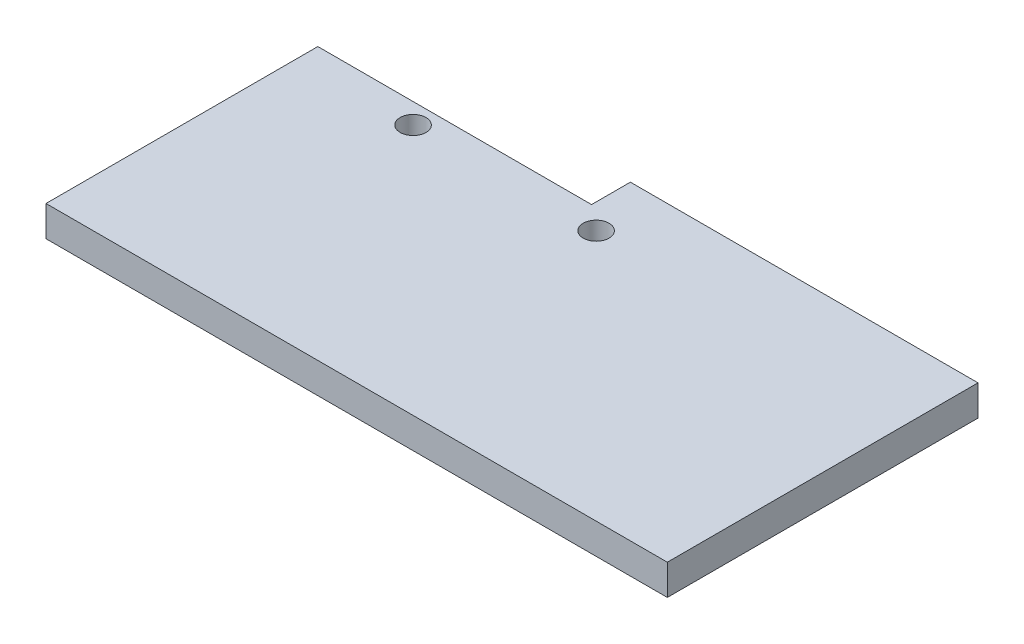
ISO-10303-21;
HEADER;
FILE_DESCRIPTION(('STEP AP214'),'2;1');
FILE_NAME('part.step','',(''),(''),'','','');
FILE_SCHEMA(('AUTOMOTIVE_DESIGN { 1 0 10303 214 1 1 1 1 }'));
ENDSEC;
DATA;
#1=APPLICATION_CONTEXT('core data for automotive mechanical design processes');
#2=APPLICATION_PROTOCOL_DEFINITION('international standard','automotive_design',2000,#1);
#3=PRODUCT_CONTEXT('',#1,'mechanical');
#4=PRODUCT('Part','Part','',(#3));
#5=PRODUCT_RELATED_PRODUCT_CATEGORY('part','',(#4));
#6=PRODUCT_DEFINITION_FORMATION('','',#4);
#7=PRODUCT_DEFINITION_CONTEXT('part definition',#1,'design');
#8=PRODUCT_DEFINITION('design','',#6,#7);
#9=PRODUCT_DEFINITION_SHAPE('','',#8);
#10=(LENGTH_UNIT() NAMED_UNIT(*) SI_UNIT(.MILLI.,.METRE.));
#11=(NAMED_UNIT(*) PLANE_ANGLE_UNIT() SI_UNIT($,.RADIAN.));
#12=(NAMED_UNIT(*) SI_UNIT($,.STERADIAN.) SOLID_ANGLE_UNIT());
#13=UNCERTAINTY_MEASURE_WITH_UNIT(LENGTH_MEASURE(1.E-05),#10,'distance_accuracy_value','');
#14=(GEOMETRIC_REPRESENTATION_CONTEXT(3) GLOBAL_UNCERTAINTY_ASSIGNED_CONTEXT((#13)) GLOBAL_UNIT_ASSIGNED_CONTEXT((#10,
#11,#12)) REPRESENTATION_CONTEXT('',''));
#15=CARTESIAN_POINT('',(0.,0.,0.));
#16=DIRECTION('',(0.,0.,1.));
#17=DIRECTION('',(1.,0.,0.));
#18=AXIS2_PLACEMENT_3D('',#15,#16,#17);
#19=CARTESIAN_POINT('',(-50.9391301805522,59.944,-35.3639480629795));
#20=DIRECTION('',(1.,0.,0.));
#21=DIRECTION('',(0.,0.,-1.));
#22=AXIS2_PLACEMENT_3D('',#19,#20,#21);
#23=PLANE('',#22);
#24=DIRECTION('',(0.,0.,1.));
#25=VECTOR('',#24,1.);
#26=CARTESIAN_POINT('',(-50.9391301805522,59.944,-35.3639480629795));
#27=LINE('',#26,#25);
#28=CARTESIAN_POINT('',(-50.9391301805522,59.944,40.8360519370205));
#29=VERTEX_POINT('',#28);
#30=CARTESIAN_POINT('',(-50.9391301805521,59.944,574.236051937021));
#31=VERTEX_POINT('',#30);
#32=EDGE_CURVE('E76',#29,#31,#27,.T.);
#33=ORIENTED_EDGE('',*,*,#32,.F.);
#34=DIRECTION('',(0.,-1.,0.));
#35=VECTOR('',#34,1.);
#36=CARTESIAN_POINT('',(-50.9391301805522,59.944,40.8360519370205));
#37=LINE('',#36,#35);
#38=CARTESIAN_POINT('',(-50.9391301805522,0.,40.8360519370205));
#39=VERTEX_POINT('',#38);
#40=EDGE_CURVE('E96',#29,#39,#37,.T.);
#41=ORIENTED_EDGE('',*,*,#40,.T.);
#42=DIRECTION('',(0.,0.,1.));
#43=VECTOR('',#42,1.);
#44=CARTESIAN_POINT('',(-50.9391301805522,0.,-35.3639480629795));
#45=LINE('',#44,#43);
#46=CARTESIAN_POINT('',(-50.9391301805521,0.,574.236051937021));
#47=VERTEX_POINT('',#46);
#48=EDGE_CURVE('E113',#39,#47,#45,.T.);
#49=ORIENTED_EDGE('',*,*,#48,.T.);
#50=DIRECTION('',(0.,-1.,0.));
#51=VECTOR('',#50,1.);
#52=CARTESIAN_POINT('',(-50.9391301805521,59.944,574.236051937021));
#53=LINE('',#52,#51);
#54=EDGE_CURVE('E38',#31,#47,#53,.T.);
#55=ORIENTED_EDGE('',*,*,#54,.F.);
#56=EDGE_LOOP('',(#33,#41,#49,#55));
#57=FACE_BOUND('',#56,.T.);
#58=ADVANCED_FACE('F31',(#57),#23,.F.);
#59=CARTESIAN_POINT('',(-50.9391301805521,59.944,574.236051937021));
#60=DIRECTION('',(0.,0.,-1.));
#61=DIRECTION('',(-1.,0.,0.));
#62=AXIS2_PLACEMENT_3D('',#59,#60,#61);
#63=PLANE('',#62);
#64=DIRECTION('',(1.,0.,0.));
#65=VECTOR('',#64,1.);
#66=CARTESIAN_POINT('',(-50.9391301805521,0.,574.236051937021));
#67=LINE('',#66,#65);
#68=CARTESIAN_POINT('',(1168.26086981945,0.,574.236051937021));
#69=VERTEX_POINT('',#68);
#70=EDGE_CURVE('E122',#47,#69,#67,.T.);
#71=ORIENTED_EDGE('',*,*,#70,.T.);
#72=DIRECTION('',(0.,-1.,0.));
#73=VECTOR('',#72,1.);
#74=CARTESIAN_POINT('',(1168.26086981945,59.944,574.236051937021));
#75=LINE('',#74,#73);
#76=CARTESIAN_POINT('',(1168.26086981945,59.944,574.236051937021));
#77=VERTEX_POINT('',#76);
#78=EDGE_CURVE('E128',#77,#69,#75,.T.);
#79=ORIENTED_EDGE('',*,*,#78,.F.);
#80=DIRECTION('',(1.,0.,0.));
#81=VECTOR('',#80,1.);
#82=CARTESIAN_POINT('',(-50.9391301805521,59.944,574.236051937021));
#83=LINE('',#82,#81);
#84=EDGE_CURVE('E115',#31,#77,#83,.T.);
#85=ORIENTED_EDGE('',*,*,#84,.F.);
#86=ORIENTED_EDGE('',*,*,#54,.T.);
#87=EDGE_LOOP('',(#71,#79,#85,#86));
#88=FACE_BOUND('',#87,.T.);
#89=ADVANCED_FACE('F132',(#88),#63,.F.);
#90=CARTESIAN_POINT('',(1168.26086981945,59.944,-35.3639480629795));
#91=DIRECTION('',(-1.,0.,0.));
#92=DIRECTION('',(0.,0.,1.));
#93=AXIS2_PLACEMENT_3D('',#90,#91,#92);
#94=PLANE('',#93);
#95=DIRECTION('',(0.,0.,-1.));
#96=VECTOR('',#95,1.);
#97=CARTESIAN_POINT('',(1168.26086981945,0.,-35.3639480629795));
#98=LINE('',#97,#96);
#99=CARTESIAN_POINT('',(1168.26086981945,0.,-35.3639480629795));
#100=VERTEX_POINT('',#99);
#101=EDGE_CURVE('E71',#69,#100,#98,.T.);
#102=ORIENTED_EDGE('',*,*,#101,.T.);
#103=DIRECTION('',(0.,-1.,0.));
#104=VECTOR('',#103,1.);
#105=CARTESIAN_POINT('',(1168.26086981945,59.944,-35.3639480629795));
#106=LINE('',#105,#104);
#107=CARTESIAN_POINT('',(1168.26086981945,59.944,-35.3639480629795));
#108=VERTEX_POINT('',#107);
#109=EDGE_CURVE('E120',#108,#100,#106,.T.);
#110=ORIENTED_EDGE('',*,*,#109,.F.);
#111=DIRECTION('',(0.,0.,-1.));
#112=VECTOR('',#111,1.);
#113=CARTESIAN_POINT('',(1168.26086981945,59.944,-35.3639480629795));
#114=LINE('',#113,#112);
#115=EDGE_CURVE('E54',#77,#108,#114,.T.);
#116=ORIENTED_EDGE('',*,*,#115,.F.);
#117=ORIENTED_EDGE('',*,*,#78,.T.);
#118=EDGE_LOOP('',(#102,#110,#116,#117));
#119=FACE_BOUND('',#118,.T.);
#120=ADVANCED_FACE('F142',(#119),#94,.F.);
#121=CARTESIAN_POINT('',(-50.9391301805522,59.944,-35.3639480629795));
#122=DIRECTION('',(0.,0.,1.));
#123=DIRECTION('',(1.,0.,0.));
#124=AXIS2_PLACEMENT_3D('',#121,#122,#123);
#125=PLANE('',#124);
#126=DIRECTION('',(-1.,0.,0.));
#127=VECTOR('',#126,1.);
#128=CARTESIAN_POINT('',(-50.9391301805522,0.,-35.3639480629795));
#129=LINE('',#128,#127);
#130=CARTESIAN_POINT('',(486.175364780351,0.,-35.3639480629795));
#131=VERTEX_POINT('',#130);
#132=EDGE_CURVE('E116',#100,#131,#129,.T.);
#133=ORIENTED_EDGE('',*,*,#132,.T.);
#134=DIRECTION('',(0.,1.,0.));
#135=VECTOR('',#134,1.);
#136=CARTESIAN_POINT('',(486.175364780351,59.944,-35.3639480629795));
#137=LINE('',#136,#135);
#138=CARTESIAN_POINT('',(486.175364780351,59.944,-35.3639480629795));
#139=VERTEX_POINT('',#138);
#140=EDGE_CURVE('E111',#131,#139,#137,.T.);
#141=ORIENTED_EDGE('',*,*,#140,.T.);
#142=DIRECTION('',(-1.,0.,0.));
#143=VECTOR('',#142,1.);
#144=CARTESIAN_POINT('',(-50.9391301805522,59.944,-35.3639480629795));
#145=LINE('',#144,#143);
#146=EDGE_CURVE('E106',#108,#139,#145,.T.);
#147=ORIENTED_EDGE('',*,*,#146,.F.);
#148=ORIENTED_EDGE('',*,*,#109,.T.);
#149=EDGE_LOOP('',(#133,#141,#147,#148));
#150=FACE_BOUND('',#149,.T.);
#151=ADVANCED_FACE('F141',(#150),#125,.F.);
#152=CARTESIAN_POINT('',(-50.9391301805521,59.944,574.236051937021));
#153=DIRECTION('',(0.,1.,0.));
#154=DIRECTION('',(0.,0.,1.));
#155=AXIS2_PLACEMENT_3D('',#152,#153,#154);
#156=PLANE('',#155);
#157=CARTESIAN_POINT('',(535.065992240831,59.944,80.7411743584032));
#158=DIRECTION('',(0.,1.,0.));
#159=DIRECTION('',(0.,0.,-1.));
#160=AXIS2_PLACEMENT_3D('',#157,#158,#159);
#161=CIRCLE('',#160,25.4000000000001);
#162=CARTESIAN_POINT('',(535.065992240831,59.944,55.3411743584031));
#163=VERTEX_POINT('',#162);
#164=EDGE_CURVE('E231',#163,#163,#161,.T.);
#165=ORIENTED_EDGE('',*,*,#164,.F.);
#166=EDGE_LOOP('',(#165));
#167=FACE_BOUND('',#166,.T.);
#168=CARTESIAN_POINT('',(175.855747398064,59.944,80.7411743584033));
#169=DIRECTION('',(0.,1.,0.));
#170=DIRECTION('',(0.,0.,1.));
#171=AXIS2_PLACEMENT_3D('',#168,#169,#170);
#172=CIRCLE('',#171,25.4);
#173=CARTESIAN_POINT('',(175.855747398064,59.944,106.141174358403));
#174=VERTEX_POINT('',#173);
#175=EDGE_CURVE('E233',#174,#174,#172,.T.);
#176=ORIENTED_EDGE('',*,*,#175,.F.);
#177=EDGE_LOOP('',(#176));
#178=FACE_BOUND('',#177,.T.);
#179=DIRECTION('',(0.,0.,-1.));
#180=VECTOR('',#179,1.);
#181=CARTESIAN_POINT('',(486.175364780351,59.944,-55.4152351229247));
#182=LINE('',#181,#180);
#183=CARTESIAN_POINT('',(486.175364780351,59.944,40.8360519370205));
#184=VERTEX_POINT('',#183);
#185=EDGE_CURVE('E98',#184,#139,#182,.T.);
#186=ORIENTED_EDGE('',*,*,#185,.F.);
#187=DIRECTION('',(1.,0.,0.));
#188=VECTOR('',#187,1.);
#189=CARTESIAN_POINT('',(486.175364780351,59.944,40.8360519370205));
#190=LINE('',#189,#188);
#191=EDGE_CURVE('E92',#29,#184,#190,.T.);
#192=ORIENTED_EDGE('',*,*,#191,.F.);
#193=ORIENTED_EDGE('',*,*,#32,.T.);
#194=ORIENTED_EDGE('',*,*,#84,.T.);
#195=ORIENTED_EDGE('',*,*,#115,.T.);
#196=ORIENTED_EDGE('',*,*,#146,.T.);
#197=EDGE_LOOP('',(#186,#192,#193,#194,#195,#196));
#198=FACE_BOUND('',#197,.T.);
#199=ADVANCED_FACE('F104',(#167,#178,#198),#156,.T.);
#200=CARTESIAN_POINT('',(-50.9391301805521,0.,574.236051937021));
#201=DIRECTION('',(0.,1.,0.));
#202=DIRECTION('',(0.,0.,1.));
#203=AXIS2_PLACEMENT_3D('',#200,#201,#202);
#204=PLANE('',#203);
#205=CARTESIAN_POINT('',(535.065992240831,0.,80.7411743584032));
#206=DIRECTION('',(0.,1.,0.));
#207=DIRECTION('',(0.,0.,-1.));
#208=AXIS2_PLACEMENT_3D('',#205,#206,#207);
#209=CIRCLE('',#208,25.4000000000001);
#210=CARTESIAN_POINT('',(535.065992240831,0.,55.3411743584031));
#211=VERTEX_POINT('',#210);
#212=EDGE_CURVE('E228',#211,#211,#209,.T.);
#213=ORIENTED_EDGE('',*,*,#212,.T.);
#214=EDGE_LOOP('',(#213));
#215=FACE_BOUND('',#214,.T.);
#216=CARTESIAN_POINT('',(175.855747398064,0.,80.7411743584033));
#217=DIRECTION('',(0.,1.,0.));
#218=DIRECTION('',(0.,0.,1.));
#219=AXIS2_PLACEMENT_3D('',#216,#217,#218);
#220=CIRCLE('',#219,25.4);
#221=CARTESIAN_POINT('',(175.855747398064,0.,106.141174358403));
#222=VERTEX_POINT('',#221);
#223=EDGE_CURVE('E99',#222,#222,#220,.T.);
#224=ORIENTED_EDGE('',*,*,#223,.T.);
#225=EDGE_LOOP('',(#224));
#226=FACE_BOUND('',#225,.T.);
#227=DIRECTION('',(1.,0.,0.));
#228=VECTOR('',#227,1.);
#229=CARTESIAN_POINT('',(-50.9391301805522,0.,40.8360519370206));
#230=LINE('',#229,#228);
#231=CARTESIAN_POINT('',(486.175364780351,0.,40.8360519370205));
#232=VERTEX_POINT('',#231);
#233=EDGE_CURVE('E11',#39,#232,#230,.T.);
#234=ORIENTED_EDGE('',*,*,#233,.T.);
#235=DIRECTION('',(0.,0.,-1.));
#236=VECTOR('',#235,1.);
#237=CARTESIAN_POINT('',(486.175364780351,0.,-55.4152351229247));
#238=LINE('',#237,#236);
#239=EDGE_CURVE('E45',#232,#131,#238,.T.);
#240=ORIENTED_EDGE('',*,*,#239,.T.);
#241=ORIENTED_EDGE('',*,*,#132,.F.);
#242=ORIENTED_EDGE('',*,*,#101,.F.);
#243=ORIENTED_EDGE('',*,*,#70,.F.);
#244=ORIENTED_EDGE('',*,*,#48,.F.);
#245=EDGE_LOOP('',(#234,#240,#241,#242,#243,#244));
#246=FACE_BOUND('',#245,.T.);
#247=ADVANCED_FACE('F138',(#215,#226,#246),#204,.F.);
#248=CARTESIAN_POINT('',(486.175364780351,0.,-55.4152351229247));
#249=DIRECTION('',(1.,0.,0.));
#250=DIRECTION('',(0.,0.,-1.));
#251=AXIS2_PLACEMENT_3D('',#248,#249,#250);
#252=PLANE('',#251);
#253=ORIENTED_EDGE('',*,*,#239,.F.);
#254=DIRECTION('',(0.,1.,0.));
#255=VECTOR('',#254,1.);
#256=CARTESIAN_POINT('',(486.175364780351,0.,40.8360519370205));
#257=LINE('',#256,#255);
#258=EDGE_CURVE('E94',#232,#184,#257,.T.);
#259=ORIENTED_EDGE('',*,*,#258,.T.);
#260=ORIENTED_EDGE('',*,*,#185,.T.);
#261=ORIENTED_EDGE('',*,*,#140,.F.);
#262=EDGE_LOOP('',(#253,#259,#260,#261));
#263=FACE_BOUND('',#262,.T.);
#264=ADVANCED_FACE('F101',(#263),#252,.F.);
#265=CARTESIAN_POINT('',(486.175364780351,0.,40.8360519370205));
#266=DIRECTION('',(0.,0.,1.));
#267=DIRECTION('',(1.,0.,0.));
#268=AXIS2_PLACEMENT_3D('',#265,#266,#267);
#269=PLANE('',#268);
#270=ORIENTED_EDGE('',*,*,#191,.T.);
#271=ORIENTED_EDGE('',*,*,#258,.F.);
#272=ORIENTED_EDGE('',*,*,#233,.F.);
#273=ORIENTED_EDGE('',*,*,#40,.F.);
#274=EDGE_LOOP('',(#270,#271,#272,#273));
#275=FACE_BOUND('',#274,.T.);
#276=ADVANCED_FACE('F93',(#275),#269,.F.);
#277=CARTESIAN_POINT('',(175.855747398064,0.,80.7411743584033));
#278=DIRECTION('',(0.,1.,0.));
#279=DIRECTION('',(0.,0.,1.));
#280=AXIS2_PLACEMENT_3D('',#277,#278,#279);
#281=CYLINDRICAL_SURFACE('',#280,25.4);
#282=ORIENTED_EDGE('',*,*,#223,.F.);
#283=EDGE_LOOP('',(#282));
#284=FACE_BOUND('',#283,.T.);
#285=ORIENTED_EDGE('',*,*,#175,.T.);
#286=EDGE_LOOP('',(#285));
#287=FACE_BOUND('',#286,.T.);
#288=ADVANCED_FACE('F200',(#284,#287),#281,.F.);
#289=CARTESIAN_POINT('',(535.065992240831,0.,80.7411743584032));
#290=DIRECTION('',(0.,1.,0.));
#291=DIRECTION('',(0.,0.,1.));
#292=AXIS2_PLACEMENT_3D('',#289,#290,#291);
#293=CYLINDRICAL_SURFACE('',#292,25.4000000000001);
#294=ORIENTED_EDGE('',*,*,#212,.F.);
#295=EDGE_LOOP('',(#294));
#296=FACE_BOUND('',#295,.T.);
#297=ORIENTED_EDGE('',*,*,#164,.T.);
#298=EDGE_LOOP('',(#297));
#299=FACE_BOUND('',#298,.T.);
#300=ADVANCED_FACE('F207',(#296,#299),#293,.F.);
#301=CLOSED_SHELL('',(#58,#89,#120,#151,#199,#247,#264,#276,#288,#300));
#302=MANIFOLD_SOLID_BREP('B2',#301);
#303=ADVANCED_BREP_SHAPE_REPRESENTATION('',(#18,#302),#14);
#304=SHAPE_DEFINITION_REPRESENTATION(#9,#303);
ENDSEC;
END-ISO-10303-21;
